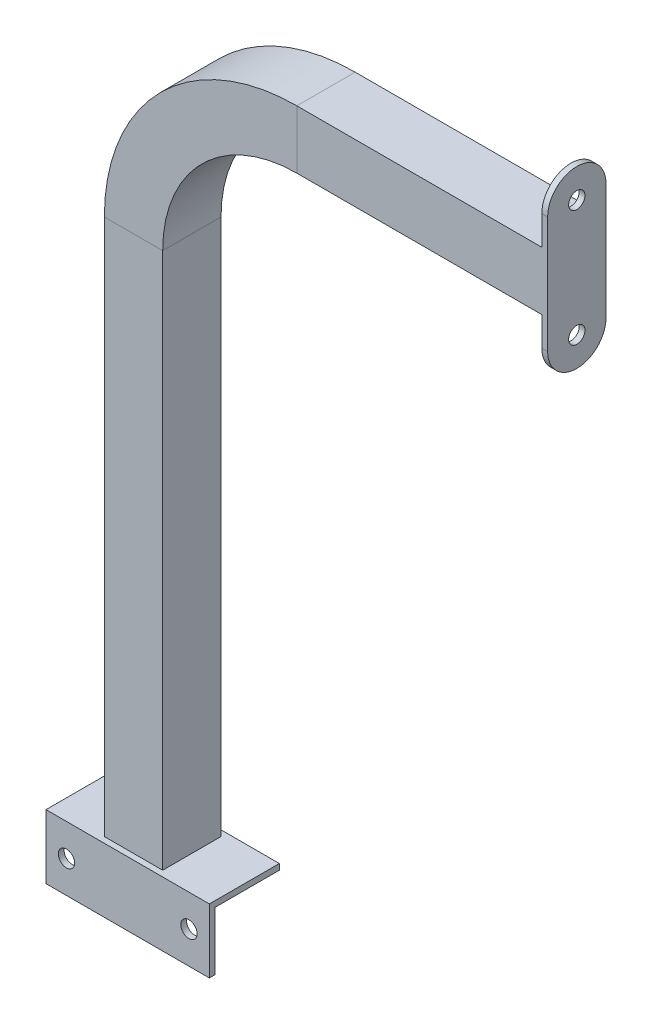
ISO-10303-21;
HEADER;
FILE_DESCRIPTION(('STEP AP214'),'2;1');
FILE_NAME('part.step','',(''),(''),'','','');
FILE_SCHEMA(('AUTOMOTIVE_DESIGN { 1 0 10303 214 1 1 1 1 }'));
ENDSEC;
DATA;
#1=APPLICATION_CONTEXT('core data for automotive mechanical design processes');
#2=APPLICATION_PROTOCOL_DEFINITION('international standard','automotive_design',2000,#1);
#3=PRODUCT_CONTEXT('',#1,'mechanical');
#4=PRODUCT('Part','Part','',(#3));
#5=PRODUCT_RELATED_PRODUCT_CATEGORY('part','',(#4));
#6=PRODUCT_DEFINITION_FORMATION('','',#4);
#7=PRODUCT_DEFINITION_CONTEXT('part definition',#1,'design');
#8=PRODUCT_DEFINITION('design','',#6,#7);
#9=PRODUCT_DEFINITION_SHAPE('','',#8);
#10=(LENGTH_UNIT() NAMED_UNIT(*) SI_UNIT(.MILLI.,.METRE.));
#11=(NAMED_UNIT(*) PLANE_ANGLE_UNIT() SI_UNIT($,.RADIAN.));
#12=(NAMED_UNIT(*) SI_UNIT($,.STERADIAN.) SOLID_ANGLE_UNIT());
#13=UNCERTAINTY_MEASURE_WITH_UNIT(LENGTH_MEASURE(1.E-05),#10,'distance_accuracy_value','');
#14=(GEOMETRIC_REPRESENTATION_CONTEXT(3) GLOBAL_UNCERTAINTY_ASSIGNED_CONTEXT((#13)) GLOBAL_UNIT_ASSIGNED_CONTEXT((#10,
#11,#12)) REPRESENTATION_CONTEXT('',''));
#15=CARTESIAN_POINT('',(0.,0.,0.));
#16=DIRECTION('',(0.,0.,1.));
#17=DIRECTION('',(1.,0.,0.));
#18=AXIS2_PLACEMENT_3D('',#15,#16,#17);
#19=CARTESIAN_POINT('',(0.,0.,0.));
#20=DIRECTION('',(0.,-1.,0.));
#21=DIRECTION('',(0.,0.,-1.));
#22=AXIS2_PLACEMENT_3D('',#19,#20,#21);
#23=PLANE('',#22);
#24=DIRECTION('',(1.,0.,0.));
#25=VECTOR('',#24,1.);
#26=CARTESIAN_POINT('',(70.0000000000001,0.,30.));
#27=LINE('',#26,#25);
#28=CARTESIAN_POINT('',(-69.9999999999999,0.,30.));
#29=VERTEX_POINT('',#28);
#30=CARTESIAN_POINT('',(70.0000000000001,0.,30.));
#31=VERTEX_POINT('',#30);
#32=EDGE_CURVE('E247',#29,#31,#27,.T.);
#33=ORIENTED_EDGE('',*,*,#32,.T.);
#34=DIRECTION('',(0.,0.,-1.));
#35=VECTOR('',#34,1.);
#36=CARTESIAN_POINT('',(70.0000000000001,0.,30.));
#37=LINE('',#36,#35);
#38=CARTESIAN_POINT('',(69.9999999999999,0.,-30.));
#39=VERTEX_POINT('',#38);
#40=EDGE_CURVE('E244',#31,#39,#37,.T.);
#41=ORIENTED_EDGE('',*,*,#40,.T.);
#42=DIRECTION('',(-1.,0.,0.));
#43=VECTOR('',#42,1.);
#44=CARTESIAN_POINT('',(69.9999999999999,0.,-30.));
#45=LINE('',#44,#43);
#46=CARTESIAN_POINT('',(-69.9999999999999,0.,-30.));
#47=VERTEX_POINT('',#46);
#48=EDGE_CURVE('E242',#39,#47,#45,.T.);
#49=ORIENTED_EDGE('',*,*,#48,.T.);
#50=DIRECTION('',(0.,0.,1.));
#51=VECTOR('',#50,1.);
#52=CARTESIAN_POINT('',(-69.9999999999999,0.,30.));
#53=LINE('',#52,#51);
#54=EDGE_CURVE('E238',#47,#29,#53,.T.);
#55=ORIENTED_EDGE('',*,*,#54,.T.);
#56=EDGE_LOOP('',(#33,#41,#49,#55));
#57=FACE_BOUND('',#56,.T.);
#58=DIRECTION('',(0.,0.,1.));
#59=VECTOR('',#58,1.);
#60=CARTESIAN_POINT('',(-25.,0.,25.));
#61=LINE('',#60,#59);
#62=CARTESIAN_POINT('',(-25.,0.,-25.));
#63=VERTEX_POINT('',#62);
#64=CARTESIAN_POINT('',(-25.,0.,25.));
#65=VERTEX_POINT('',#64);
#66=EDGE_CURVE('E293',#63,#65,#61,.T.);
#67=ORIENTED_EDGE('',*,*,#66,.F.);
#68=DIRECTION('',(-1.,0.,0.));
#69=VECTOR('',#68,1.);
#70=CARTESIAN_POINT('',(25.,0.,-25.));
#71=LINE('',#70,#69);
#72=CARTESIAN_POINT('',(25.,0.,-25.));
#73=VERTEX_POINT('',#72);
#74=EDGE_CURVE('E343',#73,#63,#71,.T.);
#75=ORIENTED_EDGE('',*,*,#74,.F.);
#76=DIRECTION('',(0.,0.,-1.));
#77=VECTOR('',#76,1.);
#78=CARTESIAN_POINT('',(25.,0.,25.));
#79=LINE('',#78,#77);
#80=CARTESIAN_POINT('',(25.,0.,25.));
#81=VERTEX_POINT('',#80);
#82=EDGE_CURVE('E348',#81,#73,#79,.T.);
#83=ORIENTED_EDGE('',*,*,#82,.F.);
#84=DIRECTION('',(1.,0.,0.));
#85=VECTOR('',#84,1.);
#86=CARTESIAN_POINT('',(25.,0.,25.));
#87=LINE('',#86,#85);
#88=EDGE_CURVE('E344',#65,#81,#87,.T.);
#89=ORIENTED_EDGE('',*,*,#88,.F.);
#90=EDGE_LOOP('',(#67,#75,#83,#89));
#91=FACE_BOUND('',#90,.T.);
#92=ADVANCED_FACE('F42',(#57,#91),#23,.F.);
#93=CARTESIAN_POINT('',(70.0000000000001,-5.,30.));
#94=DIRECTION('',(0.,0.,1.));
#95=DIRECTION('',(1.,0.,0.));
#96=AXIS2_PLACEMENT_3D('',#93,#94,#95);
#97=PLANE('',#96);
#98=CARTESIAN_POINT('',(52.5,-27.5,30.));
#99=DIRECTION('',(0.,0.,-1.));
#100=DIRECTION('',(-1.,0.,0.));
#101=AXIS2_PLACEMENT_3D('',#98,#99,#100);
#102=CIRCLE('',#101,7.);
#103=CARTESIAN_POINT('',(45.5,-27.5,30.));
#104=VERTEX_POINT('',#103);
#105=EDGE_CURVE('E274',#104,#104,#102,.T.);
#106=ORIENTED_EDGE('',*,*,#105,.T.);
#107=EDGE_LOOP('',(#106));
#108=FACE_BOUND('',#107,.T.);
#109=CARTESIAN_POINT('',(-52.5,-27.5,30.));
#110=DIRECTION('',(0.,0.,-1.));
#111=DIRECTION('',(1.,0.,0.));
#112=AXIS2_PLACEMENT_3D('',#109,#110,#111);
#113=CIRCLE('',#112,7.);
#114=CARTESIAN_POINT('',(-45.5,-27.5,30.));
#115=VERTEX_POINT('',#114);
#116=EDGE_CURVE('E275',#115,#115,#113,.T.);
#117=ORIENTED_EDGE('',*,*,#116,.T.);
#118=EDGE_LOOP('',(#117));
#119=FACE_BOUND('',#118,.T.);
#120=ORIENTED_EDGE('',*,*,#32,.F.);
#121=DIRECTION('',(0.,1.,0.));
#122=VECTOR('',#121,1.);
#123=CARTESIAN_POINT('',(-69.9999999999999,-5.,30.));
#124=LINE('',#123,#122);
#125=CARTESIAN_POINT('',(-69.9999999999999,-55.,30.));
#126=VERTEX_POINT('',#125);
#127=EDGE_CURVE('E11',#126,#29,#124,.T.);
#128=ORIENTED_EDGE('',*,*,#127,.F.);
#129=DIRECTION('',(-1.,0.,0.));
#130=VECTOR('',#129,1.);
#131=CARTESIAN_POINT('',(-69.9999999999999,-55.,30.));
#132=LINE('',#131,#130);
#133=CARTESIAN_POINT('',(70.0000000000001,-55.,30.));
#134=VERTEX_POINT('',#133);
#135=EDGE_CURVE('E259',#134,#126,#132,.T.);
#136=ORIENTED_EDGE('',*,*,#135,.F.);
#137=DIRECTION('',(0.,1.,0.));
#138=VECTOR('',#137,1.);
#139=CARTESIAN_POINT('',(70.0000000000001,-5.,30.));
#140=LINE('',#139,#138);
#141=EDGE_CURVE('E46',#134,#31,#140,.T.);
#142=ORIENTED_EDGE('',*,*,#141,.T.);
#143=EDGE_LOOP('',(#120,#128,#136,#142));
#144=FACE_BOUND('',#143,.T.);
#145=ADVANCED_FACE('F44',(#108,#119,#144),#97,.T.);
#146=CARTESIAN_POINT('',(-69.9999999999999,-5.,30.));
#147=DIRECTION('',(-1.,0.,0.));
#148=DIRECTION('',(0.,0.,1.));
#149=AXIS2_PLACEMENT_3D('',#146,#147,#148);
#150=PLANE('',#149);
#151=DIRECTION('',(0.,1.,0.));
#152=VECTOR('',#151,1.);
#153=CARTESIAN_POINT('',(-69.9999999999999,-5.,-30.));
#154=LINE('',#153,#152);
#155=CARTESIAN_POINT('',(-69.9999999999999,-5.,-30.));
#156=VERTEX_POINT('',#155);
#157=EDGE_CURVE('E52',#156,#47,#154,.T.);
#158=ORIENTED_EDGE('',*,*,#157,.F.);
#159=DIRECTION('',(0.,0.,1.));
#160=VECTOR('',#159,1.);
#161=CARTESIAN_POINT('',(-69.9999999999999,-5.,30.));
#162=LINE('',#161,#160);
#163=CARTESIAN_POINT('',(-69.9999999999999,-5.,25.));
#164=VERTEX_POINT('',#163);
#165=EDGE_CURVE('E215',#156,#164,#162,.T.);
#166=ORIENTED_EDGE('',*,*,#165,.T.);
#167=DIRECTION('',(0.,1.,0.));
#168=VECTOR('',#167,1.);
#169=CARTESIAN_POINT('',(-69.9999999999999,-55.,25.));
#170=LINE('',#169,#168);
#171=CARTESIAN_POINT('',(-69.9999999999999,-55.,25.));
#172=VERTEX_POINT('',#171);
#173=EDGE_CURVE('E266',#172,#164,#170,.T.);
#174=ORIENTED_EDGE('',*,*,#173,.F.);
#175=DIRECTION('',(0.,0.,-1.));
#176=VECTOR('',#175,1.);
#177=CARTESIAN_POINT('',(-69.9999999999999,-55.,30.));
#178=LINE('',#177,#176);
#179=EDGE_CURVE('E251',#126,#172,#178,.T.);
#180=ORIENTED_EDGE('',*,*,#179,.F.);
#181=ORIENTED_EDGE('',*,*,#127,.T.);
#182=ORIENTED_EDGE('',*,*,#54,.F.);
#183=EDGE_LOOP('',(#158,#166,#174,#180,#181,#182));
#184=FACE_BOUND('',#183,.T.);
#185=ADVANCED_FACE('F236',(#184),#150,.T.);
#186=CARTESIAN_POINT('',(69.9999999999999,-5.,-30.));
#187=DIRECTION('',(0.,0.,-1.));
#188=DIRECTION('',(-1.,0.,0.));
#189=AXIS2_PLACEMENT_3D('',#186,#187,#188);
#190=PLANE('',#189);
#191=DIRECTION('',(1.,0.,0.));
#192=VECTOR('',#191,1.);
#193=CARTESIAN_POINT('',(69.9999999999999,-5.,-30.));
#194=LINE('',#193,#192);
#195=CARTESIAN_POINT('',(69.9999999999999,-5.,-30.));
#196=VERTEX_POINT('',#195);
#197=EDGE_CURVE('E218',#156,#196,#194,.T.);
#198=ORIENTED_EDGE('',*,*,#197,.F.);
#199=ORIENTED_EDGE('',*,*,#157,.T.);
#200=ORIENTED_EDGE('',*,*,#48,.F.);
#201=DIRECTION('',(0.,1.,0.));
#202=VECTOR('',#201,1.);
#203=CARTESIAN_POINT('',(69.9999999999999,-5.,-30.));
#204=LINE('',#203,#202);
#205=EDGE_CURVE('E232',#196,#39,#204,.T.);
#206=ORIENTED_EDGE('',*,*,#205,.F.);
#207=EDGE_LOOP('',(#198,#199,#200,#206));
#208=FACE_BOUND('',#207,.T.);
#209=ADVANCED_FACE('F229',(#208),#190,.T.);
#210=CARTESIAN_POINT('',(70.0000000000001,-5.,30.));
#211=DIRECTION('',(1.,0.,0.));
#212=DIRECTION('',(0.,0.,-1.));
#213=AXIS2_PLACEMENT_3D('',#210,#211,#212);
#214=PLANE('',#213);
#215=DIRECTION('',(0.,0.,-1.));
#216=VECTOR('',#215,1.);
#217=CARTESIAN_POINT('',(70.0000000000001,-5.,30.));
#218=LINE('',#217,#216);
#219=CARTESIAN_POINT('',(70.0000000000001,-5.,25.));
#220=VERTEX_POINT('',#219);
#221=EDGE_CURVE('E226',#220,#196,#218,.T.);
#222=ORIENTED_EDGE('',*,*,#221,.T.);
#223=ORIENTED_EDGE('',*,*,#205,.T.);
#224=ORIENTED_EDGE('',*,*,#40,.F.);
#225=ORIENTED_EDGE('',*,*,#141,.F.);
#226=DIRECTION('',(0.,0.,1.));
#227=VECTOR('',#226,1.);
#228=CARTESIAN_POINT('',(70.0000000000001,-55.,30.));
#229=LINE('',#228,#227);
#230=CARTESIAN_POINT('',(70.0000000000001,-55.,25.));
#231=VERTEX_POINT('',#230);
#232=EDGE_CURVE('E256',#231,#134,#229,.T.);
#233=ORIENTED_EDGE('',*,*,#232,.F.);
#234=DIRECTION('',(0.,1.,0.));
#235=VECTOR('',#234,1.);
#236=CARTESIAN_POINT('',(70.0000000000001,-55.,25.));
#237=LINE('',#236,#235);
#238=EDGE_CURVE('E262',#231,#220,#237,.T.);
#239=ORIENTED_EDGE('',*,*,#238,.T.);
#240=EDGE_LOOP('',(#222,#223,#224,#225,#233,#239));
#241=FACE_BOUND('',#240,.T.);
#242=ADVANCED_FACE('F619',(#241),#214,.T.);
#243=CARTESIAN_POINT('',(0.,-5.,0.));
#244=DIRECTION('',(0.,-1.,0.));
#245=DIRECTION('',(0.,0.,-1.));
#246=AXIS2_PLACEMENT_3D('',#243,#244,#245);
#247=PLANE('',#246);
#248=ORIENTED_EDGE('',*,*,#165,.F.);
#249=ORIENTED_EDGE('',*,*,#197,.T.);
#250=ORIENTED_EDGE('',*,*,#221,.F.);
#251=DIRECTION('',(1.,0.,0.));
#252=VECTOR('',#251,1.);
#253=CARTESIAN_POINT('',(-69.9999999999999,-5.,25.));
#254=LINE('',#253,#252);
#255=EDGE_CURVE('E221',#164,#220,#254,.T.);
#256=ORIENTED_EDGE('',*,*,#255,.F.);
#257=EDGE_LOOP('',(#248,#249,#250,#256));
#258=FACE_BOUND('',#257,.T.);
#259=ADVANCED_FACE('F217',(#258),#247,.T.);
#260=CARTESIAN_POINT('',(-69.9999999999999,-55.,25.));
#261=DIRECTION('',(0.,0.,1.));
#262=DIRECTION('',(1.,0.,0.));
#263=AXIS2_PLACEMENT_3D('',#260,#261,#262);
#264=PLANE('',#263);
#265=CARTESIAN_POINT('',(52.5,-27.5,25.));
#266=DIRECTION('',(0.,0.,1.));
#267=DIRECTION('',(1.,0.,0.));
#268=AXIS2_PLACEMENT_3D('',#265,#266,#267);
#269=CIRCLE('',#268,7.);
#270=CARTESIAN_POINT('',(59.5,-27.5,25.));
#271=VERTEX_POINT('',#270);
#272=EDGE_CURVE('E268',#271,#271,#269,.T.);
#273=ORIENTED_EDGE('',*,*,#272,.T.);
#274=EDGE_LOOP('',(#273));
#275=FACE_BOUND('',#274,.T.);
#276=CARTESIAN_POINT('',(-52.5,-27.5,25.));
#277=DIRECTION('',(0.,0.,1.));
#278=DIRECTION('',(1.,0.,0.));
#279=AXIS2_PLACEMENT_3D('',#276,#277,#278);
#280=CIRCLE('',#279,7.);
#281=CARTESIAN_POINT('',(-45.5,-27.5,25.));
#282=VERTEX_POINT('',#281);
#283=EDGE_CURVE('E271',#282,#282,#280,.T.);
#284=ORIENTED_EDGE('',*,*,#283,.T.);
#285=EDGE_LOOP('',(#284));
#286=FACE_BOUND('',#285,.T.);
#287=ORIENTED_EDGE('',*,*,#255,.T.);
#288=ORIENTED_EDGE('',*,*,#238,.F.);
#289=DIRECTION('',(1.,0.,0.));
#290=VECTOR('',#289,1.);
#291=CARTESIAN_POINT('',(-69.9999999999999,-55.,25.));
#292=LINE('',#291,#290);
#293=EDGE_CURVE('E254',#172,#231,#292,.T.);
#294=ORIENTED_EDGE('',*,*,#293,.F.);
#295=ORIENTED_EDGE('',*,*,#173,.T.);
#296=EDGE_LOOP('',(#287,#288,#294,#295));
#297=FACE_BOUND('',#296,.T.);
#298=ADVANCED_FACE('F612',(#275,#286,#297),#264,.F.);
#299=CARTESIAN_POINT('',(0.,-55.,0.));
#300=DIRECTION('',(0.,-1.,0.));
#301=DIRECTION('',(0.,0.,-1.));
#302=AXIS2_PLACEMENT_3D('',#299,#300,#301);
#303=PLANE('',#302);
#304=ORIENTED_EDGE('',*,*,#179,.T.);
#305=ORIENTED_EDGE('',*,*,#293,.T.);
#306=ORIENTED_EDGE('',*,*,#232,.T.);
#307=ORIENTED_EDGE('',*,*,#135,.T.);
#308=EDGE_LOOP('',(#304,#305,#306,#307));
#309=FACE_BOUND('',#308,.T.);
#310=ADVANCED_FACE('F610',(#309),#303,.T.);
#311=CARTESIAN_POINT('',(-52.5,-27.5,30.));
#312=DIRECTION('',(0.,0.,-1.));
#313=DIRECTION('',(-1.,0.,0.));
#314=AXIS2_PLACEMENT_3D('',#311,#312,#313);
#315=CYLINDRICAL_SURFACE('',#314,7.);
#316=ORIENTED_EDGE('',*,*,#116,.F.);
#317=EDGE_LOOP('',(#316));
#318=FACE_BOUND('',#317,.T.);
#319=ORIENTED_EDGE('',*,*,#283,.F.);
#320=EDGE_LOOP('',(#319));
#321=FACE_BOUND('',#320,.T.);
#322=ADVANCED_FACE('F606',(#318,#321),#315,.F.);
#323=CARTESIAN_POINT('',(52.5,-27.5,30.));
#324=DIRECTION('',(0.,0.,-1.));
#325=DIRECTION('',(-1.,0.,0.));
#326=AXIS2_PLACEMENT_3D('',#323,#324,#325);
#327=CYLINDRICAL_SURFACE('',#326,7.);
#328=ORIENTED_EDGE('',*,*,#105,.F.);
#329=EDGE_LOOP('',(#328));
#330=FACE_BOUND('',#329,.T.);
#331=ORIENTED_EDGE('',*,*,#272,.F.);
#332=EDGE_LOOP('',(#331));
#333=FACE_BOUND('',#332,.T.);
#334=ADVANCED_FACE('F596',(#330,#333),#327,.F.);
#335=CARTESIAN_POINT('',(25.,0.,25.));
#336=DIRECTION('',(1.,0.,0.));
#337=DIRECTION('',(0.,1.,0.));
#338=AXIS2_PLACEMENT_3D('',#335,#336,#337);
#339=PLANE('',#338);
#340=DIRECTION('',(0.,1.,0.));
#341=VECTOR('',#340,1.);
#342=CARTESIAN_POINT('',(25.,0.,-25.));
#343=LINE('',#342,#341);
#344=CARTESIAN_POINT('',(24.9999999999984,460.,-25.));
#345=VERTEX_POINT('',#344);
#346=EDGE_CURVE('E321',#73,#345,#343,.T.);
#347=ORIENTED_EDGE('',*,*,#346,.T.);
#348=DIRECTION('',(0.,0.,-1.));
#349=VECTOR('',#348,1.);
#350=CARTESIAN_POINT('',(24.9999999999984,460.,25.));
#351=LINE('',#350,#349);
#352=CARTESIAN_POINT('',(24.9999999999984,460.,25.));
#353=VERTEX_POINT('',#352);
#354=EDGE_CURVE('E335',#353,#345,#351,.T.);
#355=ORIENTED_EDGE('',*,*,#354,.F.);
#356=DIRECTION('',(0.,1.,0.));
#357=VECTOR('',#356,1.);
#358=CARTESIAN_POINT('',(25.,0.,25.));
#359=LINE('',#358,#357);
#360=EDGE_CURVE('E332',#81,#353,#359,.T.);
#361=ORIENTED_EDGE('',*,*,#360,.F.);
#362=ORIENTED_EDGE('',*,*,#82,.T.);
#363=EDGE_LOOP('',(#347,#355,#361,#362));
#364=FACE_BOUND('',#363,.T.);
#365=ADVANCED_FACE('F571',(#364),#339,.T.);
#366=CARTESIAN_POINT('',(25.,0.,-25.));
#367=DIRECTION('',(0.,0.,-1.));
#368=DIRECTION('',(-1.,0.,0.));
#369=AXIS2_PLACEMENT_3D('',#366,#367,#368);
#370=PLANE('',#369);
#371=DIRECTION('',(0.,1.,0.));
#372=VECTOR('',#371,1.);
#373=CARTESIAN_POINT('',(-25.,0.,-25.));
#374=LINE('',#373,#372);
#375=CARTESIAN_POINT('',(-25.0000000000016,460.,-25.));
#376=VERTEX_POINT('',#375);
#377=EDGE_CURVE('E306',#63,#376,#374,.T.);
#378=ORIENTED_EDGE('',*,*,#377,.T.);
#379=DIRECTION('',(-1.,0.,0.));
#380=VECTOR('',#379,1.);
#381=CARTESIAN_POINT('',(24.9999999999984,460.,-25.));
#382=LINE('',#381,#380);
#383=EDGE_CURVE('E318',#345,#376,#382,.T.);
#384=ORIENTED_EDGE('',*,*,#383,.F.);
#385=ORIENTED_EDGE('',*,*,#346,.F.);
#386=ORIENTED_EDGE('',*,*,#74,.T.);
#387=EDGE_LOOP('',(#378,#384,#385,#386));
#388=FACE_BOUND('',#387,.T.);
#389=ADVANCED_FACE('F580',(#388),#370,.T.);
#390=CARTESIAN_POINT('',(-25.,0.,25.));
#391=DIRECTION('',(-1.,0.,0.));
#392=DIRECTION('',(0.,-1.,0.));
#393=AXIS2_PLACEMENT_3D('',#390,#391,#392);
#394=PLANE('',#393);
#395=DIRECTION('',(0.,1.,0.));
#396=VECTOR('',#395,1.);
#397=CARTESIAN_POINT('',(-25.,0.,25.));
#398=LINE('',#397,#396);
#399=CARTESIAN_POINT('',(-25.0000000000016,460.,25.));
#400=VERTEX_POINT('',#399);
#401=EDGE_CURVE('E290',#65,#400,#398,.T.);
#402=ORIENTED_EDGE('',*,*,#401,.T.);
#403=DIRECTION('',(0.,0.,1.));
#404=VECTOR('',#403,1.);
#405=CARTESIAN_POINT('',(-25.0000000000016,460.,25.));
#406=LINE('',#405,#404);
#407=EDGE_CURVE('E303',#376,#400,#406,.T.);
#408=ORIENTED_EDGE('',*,*,#407,.F.);
#409=ORIENTED_EDGE('',*,*,#377,.F.);
#410=ORIENTED_EDGE('',*,*,#66,.T.);
#411=EDGE_LOOP('',(#402,#408,#409,#410));
#412=FACE_BOUND('',#411,.T.);
#413=ADVANCED_FACE('F576',(#412),#394,.T.);
#414=CARTESIAN_POINT('',(25.,0.,25.));
#415=DIRECTION('',(0.,0.,1.));
#416=DIRECTION('',(1.,0.,0.));
#417=AXIS2_PLACEMENT_3D('',#414,#415,#416);
#418=PLANE('',#417);
#419=DIRECTION('',(1.,0.,0.));
#420=VECTOR('',#419,1.);
#421=CARTESIAN_POINT('',(24.9999999999984,460.,25.));
#422=LINE('',#421,#420);
#423=EDGE_CURVE('E286',#400,#353,#422,.T.);
#424=ORIENTED_EDGE('',*,*,#423,.F.);
#425=ORIENTED_EDGE('',*,*,#401,.F.);
#426=ORIENTED_EDGE('',*,*,#88,.T.);
#427=ORIENTED_EDGE('',*,*,#360,.T.);
#428=EDGE_LOOP('',(#424,#425,#426,#427));
#429=FACE_BOUND('',#428,.T.);
#430=ADVANCED_FACE('F573',(#429),#418,.T.);
#431=CARTESIAN_POINT('',(140.,460.,0.));
#432=DIRECTION('',(0.,0.,-1.));
#433=DIRECTION('',(-1.,0.,0.));
#434=AXIS2_PLACEMENT_3D('',#431,#432,#433);
#435=CYLINDRICAL_SURFACE('',#434,115.000000000002);
#436=CARTESIAN_POINT('',(140.,460.,-25.));
#437=DIRECTION('',(0.,0.,-1.));
#438=DIRECTION('',(-1.,0.,0.));
#439=AXIS2_PLACEMENT_3D('',#436,#437,#438);
#440=CIRCLE('',#439,115.000000000002);
#441=CARTESIAN_POINT('',(140.,575.000000000002,-25.));
#442=VERTEX_POINT('',#441);
#443=EDGE_CURVE('E315',#345,#442,#440,.T.);
#444=ORIENTED_EDGE('',*,*,#443,.T.);
#445=DIRECTION('',(0.,0.,-1.));
#446=VECTOR('',#445,1.);
#447=CARTESIAN_POINT('',(140.,575.000000000002,25.));
#448=LINE('',#447,#446);
#449=CARTESIAN_POINT('',(140.,575.000000000002,25.));
#450=VERTEX_POINT('',#449);
#451=EDGE_CURVE('E327',#450,#442,#448,.T.);
#452=ORIENTED_EDGE('',*,*,#451,.F.);
#453=CARTESIAN_POINT('',(140.,460.,25.));
#454=DIRECTION('',(0.,0.,-1.));
#455=DIRECTION('',(-1.,0.,0.));
#456=AXIS2_PLACEMENT_3D('',#453,#454,#455);
#457=CIRCLE('',#456,115.000000000002);
#458=EDGE_CURVE('E289',#353,#450,#457,.T.);
#459=ORIENTED_EDGE('',*,*,#458,.F.);
#460=ORIENTED_EDGE('',*,*,#354,.T.);
#461=EDGE_LOOP('',(#444,#452,#459,#460));
#462=FACE_BOUND('',#461,.T.);
#463=ADVANCED_FACE('F563',(#462),#435,.F.);
#464=CARTESIAN_POINT('',(24.9999999999984,460.,-25.));
#465=DIRECTION('',(0.,0.,-1.));
#466=DIRECTION('',(-1.,0.,0.));
#467=AXIS2_PLACEMENT_3D('',#464,#465,#466);
#468=PLANE('',#467);
#469=CARTESIAN_POINT('',(140.,460.,-25.));
#470=DIRECTION('',(0.,0.,-1.));
#471=DIRECTION('',(-1.,0.,0.));
#472=AXIS2_PLACEMENT_3D('',#469,#470,#471);
#473=CIRCLE('',#472,165.000000000002);
#474=CARTESIAN_POINT('',(140.,625.000000000002,-25.));
#475=VERTEX_POINT('',#474);
#476=EDGE_CURVE('E300',#376,#475,#473,.T.);
#477=ORIENTED_EDGE('',*,*,#476,.T.);
#478=DIRECTION('',(0.,1.,0.));
#479=VECTOR('',#478,1.);
#480=CARTESIAN_POINT('',(140.,575.000000000002,-25.));
#481=LINE('',#480,#479);
#482=EDGE_CURVE('E312',#442,#475,#481,.T.);
#483=ORIENTED_EDGE('',*,*,#482,.F.);
#484=ORIENTED_EDGE('',*,*,#443,.F.);
#485=ORIENTED_EDGE('',*,*,#383,.T.);
#486=EDGE_LOOP('',(#477,#483,#484,#485));
#487=FACE_BOUND('',#486,.T.);
#488=ADVANCED_FACE('F582',(#487),#468,.T.);
#489=CARTESIAN_POINT('',(140.,460.,0.));
#490=DIRECTION('',(0.,0.,-1.));
#491=DIRECTION('',(-1.,0.,0.));
#492=AXIS2_PLACEMENT_3D('',#489,#490,#491);
#493=CYLINDRICAL_SURFACE('',#492,165.000000000002);
#494=CARTESIAN_POINT('',(140.,460.,25.));
#495=DIRECTION('',(0.,0.,-1.));
#496=DIRECTION('',(-1.,0.,0.));
#497=AXIS2_PLACEMENT_3D('',#494,#495,#496);
#498=CIRCLE('',#497,165.000000000002);
#499=CARTESIAN_POINT('',(140.,625.000000000002,25.));
#500=VERTEX_POINT('',#499);
#501=EDGE_CURVE('E285',#400,#500,#498,.T.);
#502=ORIENTED_EDGE('',*,*,#501,.T.);
#503=DIRECTION('',(0.,0.,1.));
#504=VECTOR('',#503,1.);
#505=CARTESIAN_POINT('',(140.,625.000000000002,25.));
#506=LINE('',#505,#504);
#507=EDGE_CURVE('E297',#475,#500,#506,.T.);
#508=ORIENTED_EDGE('',*,*,#507,.F.);
#509=ORIENTED_EDGE('',*,*,#476,.F.);
#510=ORIENTED_EDGE('',*,*,#407,.T.);
#511=EDGE_LOOP('',(#502,#508,#509,#510));
#512=FACE_BOUND('',#511,.T.);
#513=ADVANCED_FACE('F586',(#512),#493,.T.);
#514=CARTESIAN_POINT('',(24.9999999999984,460.,25.));
#515=DIRECTION('',(0.,0.,1.));
#516=DIRECTION('',(1.,0.,0.));
#517=AXIS2_PLACEMENT_3D('',#514,#515,#516);
#518=PLANE('',#517);
#519=DIRECTION('',(0.,-1.,0.));
#520=VECTOR('',#519,1.);
#521=CARTESIAN_POINT('',(140.,575.000000000002,25.));
#522=LINE('',#521,#520);
#523=EDGE_CURVE('E281',#500,#450,#522,.T.);
#524=ORIENTED_EDGE('',*,*,#523,.F.);
#525=ORIENTED_EDGE('',*,*,#501,.F.);
#526=ORIENTED_EDGE('',*,*,#423,.T.);
#527=ORIENTED_EDGE('',*,*,#458,.T.);
#528=EDGE_LOOP('',(#524,#525,#526,#527));
#529=FACE_BOUND('',#528,.T.);
#530=ADVANCED_FACE('F564',(#529),#518,.T.);
#531=CARTESIAN_POINT('',(140.,575.000000000002,25.));
#532=DIRECTION('',(0.,-1.,0.));
#533=DIRECTION('',(1.,0.,0.));
#534=AXIS2_PLACEMENT_3D('',#531,#532,#533);
#535=PLANE('',#534);
#536=DIRECTION('',(1.,0.,0.));
#537=VECTOR('',#536,1.);
#538=CARTESIAN_POINT('',(140.,575.000000000002,-25.));
#539=LINE('',#538,#537);
#540=CARTESIAN_POINT('',(350.,575.,-24.9999999999999));
#541=VERTEX_POINT('',#540);
#542=EDGE_CURVE('E309',#442,#541,#539,.T.);
#543=ORIENTED_EDGE('',*,*,#542,.T.);
#544=DIRECTION('',(0.,0.,-1.));
#545=VECTOR('',#544,1.);
#546=CARTESIAN_POINT('',(350.,575.,25.));
#547=LINE('',#546,#545);
#548=CARTESIAN_POINT('',(350.,575.,25.));
#549=VERTEX_POINT('',#548);
#550=EDGE_CURVE('E355',#549,#541,#547,.T.);
#551=ORIENTED_EDGE('',*,*,#550,.F.);
#552=DIRECTION('',(1.,0.,0.));
#553=VECTOR('',#552,1.);
#554=CARTESIAN_POINT('',(140.,575.000000000002,25.));
#555=LINE('',#554,#553);
#556=EDGE_CURVE('E284',#450,#549,#555,.T.);
#557=ORIENTED_EDGE('',*,*,#556,.F.);
#558=ORIENTED_EDGE('',*,*,#451,.T.);
#559=EDGE_LOOP('',(#543,#551,#557,#558));
#560=FACE_BOUND('',#559,.T.);
#561=ADVANCED_FACE('F556',(#560),#535,.T.);
#562=CARTESIAN_POINT('',(140.,575.000000000002,-25.));
#563=DIRECTION('',(0.,0.,-1.));
#564=DIRECTION('',(0.,1.,0.));
#565=AXIS2_PLACEMENT_3D('',#562,#563,#564);
#566=PLANE('',#565);
#567=DIRECTION('',(1.,0.,0.));
#568=VECTOR('',#567,1.);
#569=CARTESIAN_POINT('',(140.,625.000000000002,-25.));
#570=LINE('',#569,#568);
#571=CARTESIAN_POINT('',(350.,625.,-25.));
#572=VERTEX_POINT('',#571);
#573=EDGE_CURVE('E294',#475,#572,#570,.T.);
#574=ORIENTED_EDGE('',*,*,#573,.T.);
#575=DIRECTION('',(0.,1.,0.));
#576=VECTOR('',#575,1.);
#577=CARTESIAN_POINT('',(349.999999999999,550.,-24.9999999999999));
#578=LINE('',#577,#576);
#579=CARTESIAN_POINT('',(350.000000000001,650.,-24.9999999999999));
#580=VERTEX_POINT('',#579);
#581=EDGE_CURVE('E451',#572,#580,#578,.T.);
#582=ORIENTED_EDGE('',*,*,#581,.T.);
#583=DIRECTION('',(-1.,0.,0.));
#584=VECTOR('',#583,1.);
#585=CARTESIAN_POINT('',(355.000000000001,650.,-24.9999999999999));
#586=LINE('',#585,#584);
#587=CARTESIAN_POINT('',(355.000000000001,650.,-24.9999999999999));
#588=VERTEX_POINT('',#587);
#589=EDGE_CURVE('E443',#588,#580,#586,.T.);
#590=ORIENTED_EDGE('',*,*,#589,.F.);
#591=DIRECTION('',(0.,1.,0.));
#592=VECTOR('',#591,1.);
#593=CARTESIAN_POINT('',(354.999999999999,550.,-24.9999999999999));
#594=LINE('',#593,#592);
#595=CARTESIAN_POINT('',(354.999999999999,550.,-24.9999999999999));
#596=VERTEX_POINT('',#595);
#597=EDGE_CURVE('E446',#596,#588,#594,.T.);
#598=ORIENTED_EDGE('',*,*,#597,.F.);
#599=DIRECTION('',(-1.,0.,0.));
#600=VECTOR('',#599,1.);
#601=CARTESIAN_POINT('',(354.999999999999,550.,-24.9999999999999));
#602=LINE('',#601,#600);
#603=CARTESIAN_POINT('',(349.999999999999,550.,-24.9999999999999));
#604=VERTEX_POINT('',#603);
#605=EDGE_CURVE('E440',#596,#604,#602,.T.);
#606=ORIENTED_EDGE('',*,*,#605,.T.);
#607=EDGE_CURVE('E447',#604,#541,#578,.T.);
#608=ORIENTED_EDGE('',*,*,#607,.T.);
#609=ORIENTED_EDGE('',*,*,#542,.F.);
#610=ORIENTED_EDGE('',*,*,#482,.T.);
#611=EDGE_LOOP('',(#574,#582,#590,#598,#606,#608,#609,#610));
#612=FACE_BOUND('',#611,.T.);
#613=ADVANCED_FACE('F543',(#612),#566,.T.);
#614=CARTESIAN_POINT('',(140.,625.000000000002,25.));
#615=DIRECTION('',(0.,1.,0.));
#616=DIRECTION('',(-1.,0.,0.));
#617=AXIS2_PLACEMENT_3D('',#614,#615,#616);
#618=PLANE('',#617);
#619=DIRECTION('',(1.,0.,0.));
#620=VECTOR('',#619,1.);
#621=CARTESIAN_POINT('',(140.,625.000000000002,25.));
#622=LINE('',#621,#620);
#623=CARTESIAN_POINT('',(350.,625.,25.));
#624=VERTEX_POINT('',#623);
#625=EDGE_CURVE('E291',#500,#624,#622,.T.);
#626=ORIENTED_EDGE('',*,*,#625,.T.);
#627=DIRECTION('',(0.,0.,1.));
#628=VECTOR('',#627,1.);
#629=CARTESIAN_POINT('',(350.,625.,25.));
#630=LINE('',#629,#628);
#631=EDGE_CURVE('E347',#572,#624,#630,.T.);
#632=ORIENTED_EDGE('',*,*,#631,.F.);
#633=ORIENTED_EDGE('',*,*,#573,.F.);
#634=ORIENTED_EDGE('',*,*,#507,.T.);
#635=EDGE_LOOP('',(#626,#632,#633,#634));
#636=FACE_BOUND('',#635,.T.);
#637=ADVANCED_FACE('F588',(#636),#618,.T.);
#638=CARTESIAN_POINT('',(140.,575.000000000002,25.));
#639=DIRECTION('',(0.,0.,1.));
#640=DIRECTION('',(0.,-1.,0.));
#641=AXIS2_PLACEMENT_3D('',#638,#639,#640);
#642=PLANE('',#641);
#643=ORIENTED_EDGE('',*,*,#556,.T.);
#644=DIRECTION('',(0.,-1.,0.));
#645=VECTOR('',#644,1.);
#646=CARTESIAN_POINT('',(349.999999999999,550.,25.0000000000001));
#647=LINE('',#646,#645);
#648=CARTESIAN_POINT('',(349.999999999999,550.,24.9999999999998));
#649=VERTEX_POINT('',#648);
#650=EDGE_CURVE('E457',#549,#649,#647,.T.);
#651=ORIENTED_EDGE('',*,*,#650,.T.);
#652=DIRECTION('',(-1.,0.,0.));
#653=VECTOR('',#652,1.);
#654=CARTESIAN_POINT('',(354.999999999999,550.,24.9999999999998));
#655=LINE('',#654,#653);
#656=CARTESIAN_POINT('',(354.999999999999,550.,24.9999999999998));
#657=VERTEX_POINT('',#656);
#658=EDGE_CURVE('E437',#657,#649,#655,.T.);
#659=ORIENTED_EDGE('',*,*,#658,.F.);
#660=DIRECTION('',(0.,-1.,0.));
#661=VECTOR('',#660,1.);
#662=CARTESIAN_POINT('',(354.999999999999,550.,25.0000000000001));
#663=LINE('',#662,#661);
#664=CARTESIAN_POINT('',(355.000000000001,650.,25.0000000000001));
#665=VERTEX_POINT('',#664);
#666=EDGE_CURVE('E465',#665,#657,#663,.T.);
#667=ORIENTED_EDGE('',*,*,#666,.F.);
#668=DIRECTION('',(-1.,0.,0.));
#669=VECTOR('',#668,1.);
#670=CARTESIAN_POINT('',(355.000000000001,650.,25.0000000000001));
#671=LINE('',#670,#669);
#672=CARTESIAN_POINT('',(350.000000000001,650.,25.0000000000001));
#673=VERTEX_POINT('',#672);
#674=EDGE_CURVE('E336',#665,#673,#671,.T.);
#675=ORIENTED_EDGE('',*,*,#674,.T.);
#676=EDGE_CURVE('E454',#673,#624,#647,.T.);
#677=ORIENTED_EDGE('',*,*,#676,.T.);
#678=ORIENTED_EDGE('',*,*,#625,.F.);
#679=ORIENTED_EDGE('',*,*,#523,.T.);
#680=EDGE_LOOP('',(#643,#651,#659,#667,#675,#677,#678,#679));
#681=FACE_BOUND('',#680,.T.);
#682=ADVANCED_FACE('F558',(#681),#642,.T.);
#683=CARTESIAN_POINT('',(355.000000000001,650.,0.));
#684=DIRECTION('',(-1.,0.,0.));
#685=DIRECTION('',(0.,-1.,0.));
#686=AXIS2_PLACEMENT_3D('',#683,#684,#685);
#687=CYLINDRICAL_SURFACE('',#686,7.);
#688=CARTESIAN_POINT('',(355.000000000001,650.,0.));
#689=DIRECTION('',(1.,0.,0.));
#690=DIRECTION('',(0.,1.,0.));
#691=AXIS2_PLACEMENT_3D('',#688,#689,#690);
#692=CIRCLE('',#691,7.);
#693=CARTESIAN_POINT('',(355.000000000001,657.,0.));
#694=VERTEX_POINT('',#693);
#695=EDGE_CURVE('E472',#694,#694,#692,.T.);
#696=ORIENTED_EDGE('',*,*,#695,.T.);
#697=EDGE_LOOP('',(#696));
#698=FACE_BOUND('',#697,.T.);
#699=CARTESIAN_POINT('',(350.000000000001,650.,0.));
#700=DIRECTION('',(1.,0.,0.));
#701=DIRECTION('',(0.,1.,0.));
#702=AXIS2_PLACEMENT_3D('',#699,#700,#701);
#703=CIRCLE('',#702,7.);
#704=CARTESIAN_POINT('',(350.000000000001,657.,0.));
#705=VERTEX_POINT('',#704);
#706=EDGE_CURVE('E233',#705,#705,#703,.T.);
#707=ORIENTED_EDGE('',*,*,#706,.F.);
#708=EDGE_LOOP('',(#707));
#709=FACE_BOUND('',#708,.T.);
#710=ADVANCED_FACE('F480',(#698,#709),#687,.F.);
#711=CARTESIAN_POINT('',(354.999999999999,550.,-2.43390887108618E-13));
#712=DIRECTION('',(-1.,0.,0.));
#713=DIRECTION('',(0.,-1.,0.));
#714=AXIS2_PLACEMENT_3D('',#711,#712,#713);
#715=CYLINDRICAL_SURFACE('',#714,6.99999999999967);
#716=CARTESIAN_POINT('',(354.999999999999,550.,-2.43390887108618E-13));
#717=DIRECTION('',(1.,0.,0.));
#718=DIRECTION('',(0.,-1.,0.));
#719=AXIS2_PLACEMENT_3D('',#716,#717,#718);
#720=CIRCLE('',#719,6.99999999999967);
#721=CARTESIAN_POINT('',(354.999999999999,543.,-2.43390887108618E-13));
#722=VERTEX_POINT('',#721);
#723=EDGE_CURVE('E461',#722,#722,#720,.T.);
#724=ORIENTED_EDGE('',*,*,#723,.T.);
#725=EDGE_LOOP('',(#724));
#726=FACE_BOUND('',#725,.T.);
#727=CARTESIAN_POINT('',(349.999999999999,550.,-2.43390887108618E-13));
#728=DIRECTION('',(1.,0.,0.));
#729=DIRECTION('',(0.,-1.,0.));
#730=AXIS2_PLACEMENT_3D('',#727,#728,#729);
#731=CIRCLE('',#730,6.99999999999967);
#732=CARTESIAN_POINT('',(349.999999999999,543.,-2.43390887108618E-13));
#733=VERTEX_POINT('',#732);
#734=EDGE_CURVE('E469',#733,#733,#731,.T.);
#735=ORIENTED_EDGE('',*,*,#734,.F.);
#736=EDGE_LOOP('',(#735));
#737=FACE_BOUND('',#736,.T.);
#738=ADVANCED_FACE('F888',(#726,#737),#715,.F.);
#739=CARTESIAN_POINT('',(354.999999999999,550.,-2.43390887108618E-13));
#740=DIRECTION('',(-1.,0.,0.));
#741=DIRECTION('',(0.,-1.,0.));
#742=AXIS2_PLACEMENT_3D('',#739,#740,#741);
#743=CYLINDRICAL_SURFACE('',#742,25.);
#744=CARTESIAN_POINT('',(349.999999999999,550.,-2.43390887108618E-13));
#745=DIRECTION('',(1.,0.,0.));
#746=DIRECTION('',(0.,-1.,0.));
#747=AXIS2_PLACEMENT_3D('',#744,#745,#746);
#748=CIRCLE('',#747,25.);
#749=EDGE_CURVE('E452',#649,#604,#748,.T.);
#750=ORIENTED_EDGE('',*,*,#749,.T.);
#751=ORIENTED_EDGE('',*,*,#605,.F.);
#752=CARTESIAN_POINT('',(354.999999999999,550.,-2.43390887108618E-13));
#753=DIRECTION('',(1.,0.,0.));
#754=DIRECTION('',(0.,-1.,0.));
#755=AXIS2_PLACEMENT_3D('',#752,#753,#754);
#756=CIRCLE('',#755,25.);
#757=EDGE_CURVE('E463',#657,#596,#756,.T.);
#758=ORIENTED_EDGE('',*,*,#757,.F.);
#759=ORIENTED_EDGE('',*,*,#658,.T.);
#760=EDGE_LOOP('',(#750,#751,#758,#759));
#761=FACE_BOUND('',#760,.T.);
#762=ADVANCED_FACE('F497',(#761),#743,.T.);
#763=CARTESIAN_POINT('',(355.000000000001,650.,0.));
#764=DIRECTION('',(-1.,0.,0.));
#765=DIRECTION('',(0.,-1.,0.));
#766=AXIS2_PLACEMENT_3D('',#763,#764,#765);
#767=CYLINDRICAL_SURFACE('',#766,25.);
#768=CARTESIAN_POINT('',(350.000000000001,650.,0.));
#769=DIRECTION('',(1.,0.,0.));
#770=DIRECTION('',(0.,1.,0.));
#771=AXIS2_PLACEMENT_3D('',#768,#769,#770);
#772=CIRCLE('',#771,25.);
#773=EDGE_CURVE('E458',#580,#673,#772,.T.);
#774=ORIENTED_EDGE('',*,*,#773,.T.);
#775=ORIENTED_EDGE('',*,*,#674,.F.);
#776=CARTESIAN_POINT('',(355.000000000001,650.,0.));
#777=DIRECTION('',(1.,0.,0.));
#778=DIRECTION('',(0.,1.,0.));
#779=AXIS2_PLACEMENT_3D('',#776,#777,#778);
#780=CIRCLE('',#779,25.);
#781=EDGE_CURVE('E450',#588,#665,#780,.T.);
#782=ORIENTED_EDGE('',*,*,#781,.F.);
#783=ORIENTED_EDGE('',*,*,#589,.T.);
#784=EDGE_LOOP('',(#774,#775,#782,#783));
#785=FACE_BOUND('',#784,.T.);
#786=ADVANCED_FACE('F486',(#785),#767,.T.);
#787=CARTESIAN_POINT('',(355.000000000001,650.,0.));
#788=DIRECTION('',(1.,0.,0.));
#789=DIRECTION('',(0.,1.,0.));
#790=AXIS2_PLACEMENT_3D('',#787,#788,#789);
#791=PLANE('',#790);
#792=ORIENTED_EDGE('',*,*,#723,.F.);
#793=EDGE_LOOP('',(#792));
#794=FACE_BOUND('',#793,.T.);
#795=ORIENTED_EDGE('',*,*,#781,.T.);
#796=ORIENTED_EDGE('',*,*,#666,.T.);
#797=ORIENTED_EDGE('',*,*,#757,.T.);
#798=ORIENTED_EDGE('',*,*,#597,.T.);
#799=EDGE_LOOP('',(#795,#796,#797,#798));
#800=FACE_BOUND('',#799,.T.);
#801=ORIENTED_EDGE('',*,*,#695,.F.);
#802=EDGE_LOOP('',(#801));
#803=FACE_BOUND('',#802,.T.);
#804=ADVANCED_FACE('F483',(#794,#800,#803),#791,.T.);
#805=CARTESIAN_POINT('',(350.000000000001,650.,0.));
#806=DIRECTION('',(1.,0.,0.));
#807=DIRECTION('',(0.,1.,0.));
#808=AXIS2_PLACEMENT_3D('',#805,#806,#807);
#809=PLANE('',#808);
#810=ORIENTED_EDGE('',*,*,#734,.T.);
#811=EDGE_LOOP('',(#810));
#812=FACE_BOUND('',#811,.T.);
#813=ORIENTED_EDGE('',*,*,#650,.F.);
#814=ORIENTED_EDGE('',*,*,#550,.T.);
#815=ORIENTED_EDGE('',*,*,#607,.F.);
#816=ORIENTED_EDGE('',*,*,#749,.F.);
#817=EDGE_LOOP('',(#813,#814,#815,#816));
#818=FACE_BOUND('',#817,.T.);
#819=ADVANCED_FACE('F485',(#812,#818),#809,.F.);
#820=ORIENTED_EDGE('',*,*,#706,.T.);
#821=EDGE_LOOP('',(#820));
#822=FACE_BOUND('',#821,.T.);
#823=ORIENTED_EDGE('',*,*,#581,.F.);
#824=ORIENTED_EDGE('',*,*,#631,.T.);
#825=ORIENTED_EDGE('',*,*,#676,.F.);
#826=ORIENTED_EDGE('',*,*,#773,.F.);
#827=EDGE_LOOP('',(#823,#824,#825,#826));
#828=FACE_BOUND('',#827,.T.);
#829=ADVANCED_FACE('F493',(#822,#828),#809,.F.);
#830=CLOSED_SHELL('',(#92,#145,#185,#209,#242,#259,#298,#310,#322,#334,#365,#389,#413,#430,#463,
#488,#513,#530,#561,#613,#637,#682,#710,#738,#762,#786,#804,#819,#829));
#831=DIRECTION('',(0.,1.,0.));
#832=VECTOR('',#831,1.);
#833=CARTESIAN_POINT('',(350.,580.,-20.));
#834=LINE('',#833,#832);
#835=CARTESIAN_POINT('',(350.,620.,-20.));
#836=VERTEX_POINT('',#835);
#837=CARTESIAN_POINT('',(350.,580.,-20.));
#838=VERTEX_POINT('',#837);
#839=EDGE_CURVE('E375',#836,#838,#834,.F.);
#840=ORIENTED_EDGE('',*,*,#839,.T.);
#841=DIRECTION('',(0.,0.,-1.));
#842=VECTOR('',#841,1.);
#843=CARTESIAN_POINT('',(350.,580.,20.));
#844=LINE('',#843,#842);
#845=CARTESIAN_POINT('',(350.,580.,20.));
#846=VERTEX_POINT('',#845);
#847=EDGE_CURVE('E278',#838,#846,#844,.F.);
#848=ORIENTED_EDGE('',*,*,#847,.T.);
#849=DIRECTION('',(0.,-1.,0.));
#850=VECTOR('',#849,1.);
#851=CARTESIAN_POINT('',(350.,580.,20.));
#852=LINE('',#851,#850);
#853=CARTESIAN_POINT('',(350.,620.,20.));
#854=VERTEX_POINT('',#853);
#855=EDGE_CURVE('E414',#846,#854,#852,.F.);
#856=ORIENTED_EDGE('',*,*,#855,.T.);
#857=DIRECTION('',(0.,0.,1.));
#858=VECTOR('',#857,1.);
#859=CARTESIAN_POINT('',(350.,620.,20.));
#860=LINE('',#859,#858);
#861=EDGE_CURVE('E395',#854,#836,#860,.F.);
#862=ORIENTED_EDGE('',*,*,#861,.T.);
#863=EDGE_LOOP('',(#840,#848,#856,#862));
#864=FACE_BOUND('',#863,.T.);
#865=ADVANCED_FACE('F496',(#864),#809,.F.);
#866=DIRECTION('',(0.,0.,-1.));
#867=VECTOR('',#866,1.);
#868=CARTESIAN_POINT('',(20.,0.,20.));
#869=LINE('',#868,#867);
#870=CARTESIAN_POINT('',(20.,0.,-20.));
#871=VERTEX_POINT('',#870);
#872=CARTESIAN_POINT('',(20.,0.,20.));
#873=VERTEX_POINT('',#872);
#874=EDGE_CURVE('E60',#871,#873,#869,.F.);
#875=ORIENTED_EDGE('',*,*,#874,.F.);
#876=DIRECTION('',(-1.,0.,0.));
#877=VECTOR('',#876,1.);
#878=CARTESIAN_POINT('',(20.,0.,-20.));
#879=LINE('',#878,#877);
#880=CARTESIAN_POINT('',(-20.,0.,-20.));
#881=VERTEX_POINT('',#880);
#882=EDGE_CURVE('E64',#881,#871,#879,.F.);
#883=ORIENTED_EDGE('',*,*,#882,.F.);
#884=DIRECTION('',(0.,0.,1.));
#885=VECTOR('',#884,1.);
#886=CARTESIAN_POINT('',(-20.,0.,20.));
#887=LINE('',#886,#885);
#888=CARTESIAN_POINT('',(-20.,0.,20.));
#889=VERTEX_POINT('',#888);
#890=EDGE_CURVE('E392',#889,#881,#887,.F.);
#891=ORIENTED_EDGE('',*,*,#890,.F.);
#892=DIRECTION('',(1.,0.,0.));
#893=VECTOR('',#892,1.);
#894=CARTESIAN_POINT('',(20.,0.,20.));
#895=LINE('',#894,#893);
#896=EDGE_CURVE('E358',#873,#889,#895,.F.);
#897=ORIENTED_EDGE('',*,*,#896,.F.);
#898=EDGE_LOOP('',(#875,#883,#891,#897));
#899=FACE_BOUND('',#898,.T.);
#900=ADVANCED_FACE('F506',(#899),#23,.F.);
#901=CARTESIAN_POINT('',(20.,0.,20.));
#902=DIRECTION('',(-1.,0.,0.));
#903=DIRECTION('',(0.,-1.,0.));
#904=AXIS2_PLACEMENT_3D('',#901,#902,#903);
#905=PLANE('',#904);
#906=DIRECTION('',(0.,0.,-1.));
#907=VECTOR('',#906,1.);
#908=CARTESIAN_POINT('',(19.9999999999984,460.,20.));
#909=LINE('',#908,#907);
#910=CARTESIAN_POINT('',(19.9999999999984,460.,-20.));
#911=VERTEX_POINT('',#910);
#912=CARTESIAN_POINT('',(19.9999999999984,460.,20.));
#913=VERTEX_POINT('',#912);
#914=EDGE_CURVE('E367',#911,#913,#909,.F.);
#915=ORIENTED_EDGE('',*,*,#914,.F.);
#916=DIRECTION('',(0.,1.,0.));
#917=VECTOR('',#916,1.);
#918=CARTESIAN_POINT('',(20.,0.,-20.));
#919=LINE('',#918,#917);
#920=EDGE_CURVE('E371',#871,#911,#919,.T.);
#921=ORIENTED_EDGE('',*,*,#920,.F.);
#922=ORIENTED_EDGE('',*,*,#874,.T.);
#923=DIRECTION('',(0.,1.,0.));
#924=VECTOR('',#923,1.);
#925=CARTESIAN_POINT('',(20.,0.,20.));
#926=LINE('',#925,#924);
#927=EDGE_CURVE('E373',#873,#913,#926,.T.);
#928=ORIENTED_EDGE('',*,*,#927,.T.);
#929=EDGE_LOOP('',(#915,#921,#922,#928));
#930=FACE_BOUND('',#929,.T.);
#931=ADVANCED_FACE('F517',(#930),#905,.T.);
#932=CARTESIAN_POINT('',(20.,0.,20.));
#933=DIRECTION('',(0.,0.,-1.));
#934=DIRECTION('',(-1.,0.,0.));
#935=AXIS2_PLACEMENT_3D('',#932,#933,#934);
#936=PLANE('',#935);
#937=DIRECTION('',(0.,1.,0.));
#938=VECTOR('',#937,1.);
#939=CARTESIAN_POINT('',(-20.,0.,20.));
#940=LINE('',#939,#938);
#941=CARTESIAN_POINT('',(-20.0000000000016,460.,20.));
#942=VERTEX_POINT('',#941);
#943=EDGE_CURVE('E410',#889,#942,#940,.T.);
#944=ORIENTED_EDGE('',*,*,#943,.T.);
#945=DIRECTION('',(1.,0.,0.));
#946=VECTOR('',#945,1.);
#947=CARTESIAN_POINT('',(19.9999999999984,460.,20.));
#948=LINE('',#947,#946);
#949=EDGE_CURVE('E428',#913,#942,#948,.F.);
#950=ORIENTED_EDGE('',*,*,#949,.F.);
#951=ORIENTED_EDGE('',*,*,#927,.F.);
#952=ORIENTED_EDGE('',*,*,#896,.T.);
#953=EDGE_LOOP('',(#944,#950,#951,#952));
#954=FACE_BOUND('',#953,.T.);
#955=ADVANCED_FACE('F524',(#954),#936,.T.);
#956=CARTESIAN_POINT('',(-20.,0.,20.));
#957=DIRECTION('',(1.,0.,0.));
#958=DIRECTION('',(0.,1.,0.));
#959=AXIS2_PLACEMENT_3D('',#956,#957,#958);
#960=PLANE('',#959);
#961=DIRECTION('',(0.,1.,0.));
#962=VECTOR('',#961,1.);
#963=CARTESIAN_POINT('',(-20.,0.,-20.));
#964=LINE('',#963,#962);
#965=CARTESIAN_POINT('',(-20.0000000000016,460.,-20.));
#966=VERTEX_POINT('',#965);
#967=EDGE_CURVE('E390',#881,#966,#964,.T.);
#968=ORIENTED_EDGE('',*,*,#967,.T.);
#969=DIRECTION('',(0.,0.,1.));
#970=VECTOR('',#969,1.);
#971=CARTESIAN_POINT('',(-20.0000000000016,460.,20.));
#972=LINE('',#971,#970);
#973=EDGE_CURVE('E407',#942,#966,#972,.F.);
#974=ORIENTED_EDGE('',*,*,#973,.F.);
#975=ORIENTED_EDGE('',*,*,#943,.F.);
#976=ORIENTED_EDGE('',*,*,#890,.T.);
#977=EDGE_LOOP('',(#968,#974,#975,#976));
#978=FACE_BOUND('',#977,.T.);
#979=ADVANCED_FACE('F782',(#978),#960,.T.);
#980=CARTESIAN_POINT('',(20.,0.,-20.));
#981=DIRECTION('',(0.,0.,1.));
#982=DIRECTION('',(1.,0.,0.));
#983=AXIS2_PLACEMENT_3D('',#980,#981,#982);
#984=PLANE('',#983);
#985=ORIENTED_EDGE('',*,*,#920,.T.);
#986=DIRECTION('',(-1.,0.,0.));
#987=VECTOR('',#986,1.);
#988=CARTESIAN_POINT('',(19.9999999999984,460.,-20.));
#989=LINE('',#988,#987);
#990=EDGE_CURVE('E387',#966,#911,#989,.F.);
#991=ORIENTED_EDGE('',*,*,#990,.F.);
#992=ORIENTED_EDGE('',*,*,#967,.F.);
#993=ORIENTED_EDGE('',*,*,#882,.T.);
#994=EDGE_LOOP('',(#985,#991,#992,#993));
#995=FACE_BOUND('',#994,.T.);
#996=ADVANCED_FACE('F792',(#995),#984,.T.);
#997=CARTESIAN_POINT('',(140.,460.,0.));
#998=DIRECTION('',(0.,0.,-1.));
#999=DIRECTION('',(-1.,0.,0.));
#1000=AXIS2_PLACEMENT_3D('',#997,#998,#999);
#1001=CYLINDRICAL_SURFACE('',#1000,120.000000000002);
#1002=DIRECTION('',(0.,0.,-1.));
#1003=VECTOR('',#1002,1.);
#1004=CARTESIAN_POINT('',(140.,580.000000000002,20.));
#1005=LINE('',#1004,#1003);
#1006=CARTESIAN_POINT('',(140.,580.000000000002,-20.));
#1007=VERTEX_POINT('',#1006);
#1008=CARTESIAN_POINT('',(140.,580.000000000002,20.));
#1009=VERTEX_POINT('',#1008);
#1010=EDGE_CURVE('E362',#1007,#1009,#1005,.F.);
#1011=ORIENTED_EDGE('',*,*,#1010,.F.);
#1012=CARTESIAN_POINT('',(140.,460.,-20.));
#1013=DIRECTION('',(0.,0.,-1.));
#1014=DIRECTION('',(-1.,0.,0.));
#1015=AXIS2_PLACEMENT_3D('',#1012,#1013,#1014);
#1016=CIRCLE('',#1015,120.000000000002);
#1017=EDGE_CURVE('E366',#911,#1007,#1016,.T.);
#1018=ORIENTED_EDGE('',*,*,#1017,.F.);
#1019=ORIENTED_EDGE('',*,*,#914,.T.);
#1020=CARTESIAN_POINT('',(140.,460.,20.));
#1021=DIRECTION('',(0.,0.,-1.));
#1022=DIRECTION('',(-1.,0.,0.));
#1023=AXIS2_PLACEMENT_3D('',#1020,#1021,#1022);
#1024=CIRCLE('',#1023,120.000000000002);
#1025=EDGE_CURVE('E370',#913,#1009,#1024,.T.);
#1026=ORIENTED_EDGE('',*,*,#1025,.T.);
#1027=EDGE_LOOP('',(#1011,#1018,#1019,#1026));
#1028=FACE_BOUND('',#1027,.T.);
#1029=ADVANCED_FACE('F802',(#1028),#1001,.T.);
#1030=CARTESIAN_POINT('',(19.9999999999984,460.,20.));
#1031=DIRECTION('',(0.,0.,-1.));
#1032=DIRECTION('',(-1.,0.,0.));
#1033=AXIS2_PLACEMENT_3D('',#1030,#1031,#1032);
#1034=PLANE('',#1033);
#1035=CARTESIAN_POINT('',(140.,460.,20.));
#1036=DIRECTION('',(0.,0.,-1.));
#1037=DIRECTION('',(-1.,0.,0.));
#1038=AXIS2_PLACEMENT_3D('',#1035,#1036,#1037);
#1039=CIRCLE('',#1038,160.000000000002);
#1040=CARTESIAN_POINT('',(140.,620.000000000002,20.));
#1041=VERTEX_POINT('',#1040);
#1042=EDGE_CURVE('E404',#942,#1041,#1039,.T.);
#1043=ORIENTED_EDGE('',*,*,#1042,.T.);
#1044=DIRECTION('',(0.,-1.,0.));
#1045=VECTOR('',#1044,1.);
#1046=CARTESIAN_POINT('',(140.,580.000000000002,20.));
#1047=LINE('',#1046,#1045);
#1048=EDGE_CURVE('E421',#1009,#1041,#1047,.F.);
#1049=ORIENTED_EDGE('',*,*,#1048,.F.);
#1050=ORIENTED_EDGE('',*,*,#1025,.F.);
#1051=ORIENTED_EDGE('',*,*,#949,.T.);
#1052=EDGE_LOOP('',(#1043,#1049,#1050,#1051));
#1053=FACE_BOUND('',#1052,.T.);
#1054=ADVANCED_FACE('F815',(#1053),#1034,.T.);
#1055=CARTESIAN_POINT('',(140.,460.,0.));
#1056=DIRECTION('',(0.,0.,-1.));
#1057=DIRECTION('',(-1.,0.,0.));
#1058=AXIS2_PLACEMENT_3D('',#1055,#1056,#1057);
#1059=CYLINDRICAL_SURFACE('',#1058,160.000000000002);
#1060=CARTESIAN_POINT('',(140.,460.,-20.));
#1061=DIRECTION('',(0.,0.,-1.));
#1062=DIRECTION('',(-1.,0.,0.));
#1063=AXIS2_PLACEMENT_3D('',#1060,#1061,#1062);
#1064=CIRCLE('',#1063,160.000000000002);
#1065=CARTESIAN_POINT('',(140.,620.000000000002,-20.));
#1066=VERTEX_POINT('',#1065);
#1067=EDGE_CURVE('E384',#966,#1066,#1064,.T.);
#1068=ORIENTED_EDGE('',*,*,#1067,.T.);
#1069=DIRECTION('',(0.,0.,1.));
#1070=VECTOR('',#1069,1.);
#1071=CARTESIAN_POINT('',(140.,620.000000000002,20.));
#1072=LINE('',#1071,#1070);
#1073=EDGE_CURVE('E401',#1041,#1066,#1072,.F.);
#1074=ORIENTED_EDGE('',*,*,#1073,.F.);
#1075=ORIENTED_EDGE('',*,*,#1042,.F.);
#1076=ORIENTED_EDGE('',*,*,#973,.T.);
#1077=EDGE_LOOP('',(#1068,#1074,#1075,#1076));
#1078=FACE_BOUND('',#1077,.T.);
#1079=ADVANCED_FACE('F819',(#1078),#1059,.F.);
#1080=CARTESIAN_POINT('',(19.9999999999984,460.,-20.));
#1081=DIRECTION('',(0.,0.,1.));
#1082=DIRECTION('',(1.,0.,0.));
#1083=AXIS2_PLACEMENT_3D('',#1080,#1081,#1082);
#1084=PLANE('',#1083);
#1085=ORIENTED_EDGE('',*,*,#1017,.T.);
#1086=DIRECTION('',(0.,1.,0.));
#1087=VECTOR('',#1086,1.);
#1088=CARTESIAN_POINT('',(140.,580.000000000002,-20.));
#1089=LINE('',#1088,#1087);
#1090=EDGE_CURVE('E381',#1066,#1007,#1089,.F.);
#1091=ORIENTED_EDGE('',*,*,#1090,.F.);
#1092=ORIENTED_EDGE('',*,*,#1067,.F.);
#1093=ORIENTED_EDGE('',*,*,#990,.T.);
#1094=EDGE_LOOP('',(#1085,#1091,#1092,#1093));
#1095=FACE_BOUND('',#1094,.T.);
#1096=ADVANCED_FACE('F829',(#1095),#1084,.T.);
#1097=CARTESIAN_POINT('',(140.,580.000000000002,-20.));
#1098=DIRECTION('',(0.,0.,1.));
#1099=DIRECTION('',(0.,-1.,0.));
#1100=AXIS2_PLACEMENT_3D('',#1097,#1098,#1099);
#1101=PLANE('',#1100);
#1102=DIRECTION('',(1.,0.,0.));
#1103=VECTOR('',#1102,1.);
#1104=CARTESIAN_POINT('',(140.,580.000000000002,-20.));
#1105=LINE('',#1104,#1103);
#1106=EDGE_CURVE('E361',#1007,#838,#1105,.T.);
#1107=ORIENTED_EDGE('',*,*,#1106,.T.);
#1108=ORIENTED_EDGE('',*,*,#839,.F.);
#1109=DIRECTION('',(1.,0.,0.));
#1110=VECTOR('',#1109,1.);
#1111=CARTESIAN_POINT('',(140.,620.000000000002,-20.));
#1112=LINE('',#1111,#1110);
#1113=EDGE_CURVE('E378',#1066,#836,#1112,.T.);
#1114=ORIENTED_EDGE('',*,*,#1113,.F.);
#1115=ORIENTED_EDGE('',*,*,#1090,.T.);
#1116=EDGE_LOOP('',(#1107,#1108,#1114,#1115));
#1117=FACE_BOUND('',#1116,.T.);
#1118=ADVANCED_FACE('F839',(#1117),#1101,.T.);
#1119=CARTESIAN_POINT('',(140.,620.000000000002,20.));
#1120=DIRECTION('',(0.,-1.,0.));
#1121=DIRECTION('',(1.,0.,0.));
#1122=AXIS2_PLACEMENT_3D('',#1119,#1120,#1121);
#1123=PLANE('',#1122);
#1124=ORIENTED_EDGE('',*,*,#1113,.T.);
#1125=ORIENTED_EDGE('',*,*,#861,.F.);
#1126=DIRECTION('',(1.,0.,0.));
#1127=VECTOR('',#1126,1.);
#1128=CARTESIAN_POINT('',(140.,620.000000000002,20.));
#1129=LINE('',#1128,#1127);
#1130=EDGE_CURVE('E398',#1041,#854,#1129,.T.);
#1131=ORIENTED_EDGE('',*,*,#1130,.F.);
#1132=ORIENTED_EDGE('',*,*,#1073,.T.);
#1133=EDGE_LOOP('',(#1124,#1125,#1131,#1132));
#1134=FACE_BOUND('',#1133,.T.);
#1135=ADVANCED_FACE('F857',(#1134),#1123,.T.);
#1136=CARTESIAN_POINT('',(140.,580.000000000002,20.));
#1137=DIRECTION('',(0.,0.,-1.));
#1138=DIRECTION('',(0.,1.,0.));
#1139=AXIS2_PLACEMENT_3D('',#1136,#1137,#1138);
#1140=PLANE('',#1139);
#1141=ORIENTED_EDGE('',*,*,#1130,.T.);
#1142=ORIENTED_EDGE('',*,*,#855,.F.);
#1143=DIRECTION('',(1.,0.,0.));
#1144=VECTOR('',#1143,1.);
#1145=CARTESIAN_POINT('',(140.,580.000000000002,20.));
#1146=LINE('',#1145,#1144);
#1147=EDGE_CURVE('E365',#1009,#846,#1146,.T.);
#1148=ORIENTED_EDGE('',*,*,#1147,.F.);
#1149=ORIENTED_EDGE('',*,*,#1048,.T.);
#1150=EDGE_LOOP('',(#1141,#1142,#1148,#1149));
#1151=FACE_BOUND('',#1150,.T.);
#1152=ADVANCED_FACE('F853',(#1151),#1140,.T.);
#1153=CARTESIAN_POINT('',(140.,580.000000000002,20.));
#1154=DIRECTION('',(0.,1.,0.));
#1155=DIRECTION('',(-1.,0.,0.));
#1156=AXIS2_PLACEMENT_3D('',#1153,#1154,#1155);
#1157=PLANE('',#1156);
#1158=ORIENTED_EDGE('',*,*,#847,.F.);
#1159=ORIENTED_EDGE('',*,*,#1106,.F.);
#1160=ORIENTED_EDGE('',*,*,#1010,.T.);
#1161=ORIENTED_EDGE('',*,*,#1147,.T.);
#1162=EDGE_LOOP('',(#1158,#1159,#1160,#1161));
#1163=FACE_BOUND('',#1162,.T.);
#1164=ADVANCED_FACE('F636',(#1163),#1157,.T.);
#1165=CLOSED_SHELL('',(#865,#900,#931,#955,#979,#996,#1029,#1054,#1079,#1096,#1118,#1135,#1152,#1164));
#1166=ORIENTED_CLOSED_SHELL('',*,#1165,.T.);
#1167=BREP_WITH_VOIDS('B2',#830,(#1166));
#1168=ADVANCED_BREP_SHAPE_REPRESENTATION('',(#18,#1167),#14);
#1169=SHAPE_DEFINITION_REPRESENTATION(#9,#1168);
ENDSEC;
END-ISO-10303-21;
